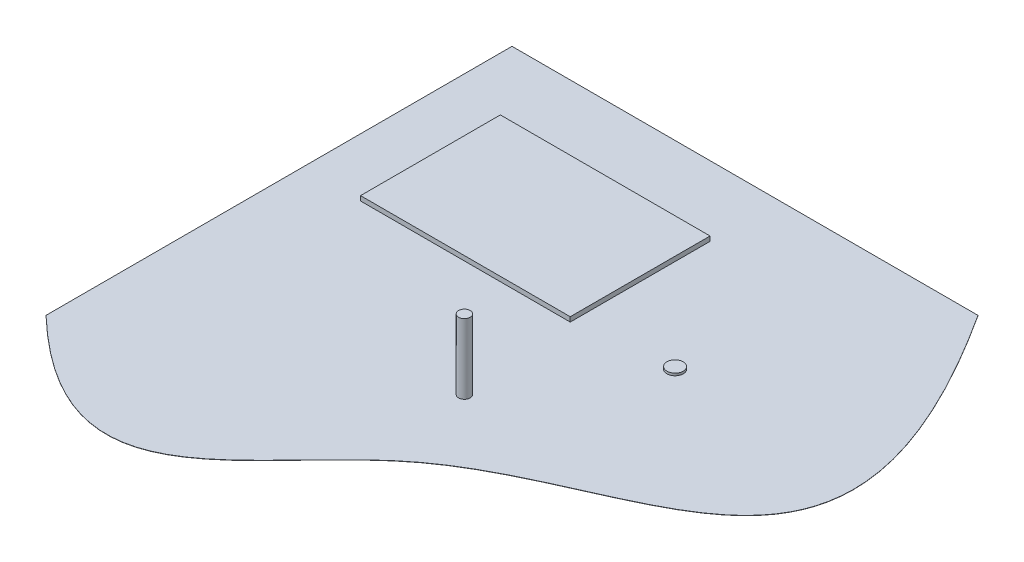
ISO-10303-21;
HEADER;
FILE_DESCRIPTION(('STEP AP214'),'2;1');
FILE_NAME('part.step','',(''),(''),'','','');
FILE_SCHEMA(('AUTOMOTIVE_DESIGN { 1 0 10303 214 1 1 1 1 }'));
ENDSEC;
DATA;
#1=APPLICATION_CONTEXT('core data for automotive mechanical design processes');
#2=APPLICATION_PROTOCOL_DEFINITION('international standard','automotive_design',2000,#1);
#3=PRODUCT_CONTEXT('',#1,'mechanical');
#4=PRODUCT('Part','Part','',(#3));
#5=PRODUCT_RELATED_PRODUCT_CATEGORY('part','',(#4));
#6=PRODUCT_DEFINITION_FORMATION('','',#4);
#7=PRODUCT_DEFINITION_CONTEXT('part definition',#1,'design');
#8=PRODUCT_DEFINITION('design','',#6,#7);
#9=PRODUCT_DEFINITION_SHAPE('','',#8);
#10=(LENGTH_UNIT() NAMED_UNIT(*) SI_UNIT(.MILLI.,.METRE.));
#11=(NAMED_UNIT(*) PLANE_ANGLE_UNIT() SI_UNIT($,.RADIAN.));
#12=(NAMED_UNIT(*) SI_UNIT($,.STERADIAN.) SOLID_ANGLE_UNIT());
#13=UNCERTAINTY_MEASURE_WITH_UNIT(LENGTH_MEASURE(1.E-05),#10,'distance_accuracy_value','');
#14=(GEOMETRIC_REPRESENTATION_CONTEXT(3) GLOBAL_UNCERTAINTY_ASSIGNED_CONTEXT((#13)) GLOBAL_UNIT_ASSIGNED_CONTEXT((#10,
#11,#12)) REPRESENTATION_CONTEXT('',''));
#15=CARTESIAN_POINT('',(0.,0.,0.));
#16=DIRECTION('',(0.,0.,1.));
#17=DIRECTION('',(1.,0.,0.));
#18=AXIS2_PLACEMENT_3D('',#15,#16,#17);
#19=CARTESIAN_POINT('',(11923.76789565,3010.,13966.178533957));
#20=DIRECTION('',(0.,-1.,0.));
#21=DIRECTION('',(0.,0.,-1.));
#22=AXIS2_PLACEMENT_3D('',#19,#20,#21);
#23=CYLINDRICAL_SURFACE('',#22,249.999999999999);
#24=CARTESIAN_POINT('',(11923.76789565,3010.,13966.178533957));
#25=DIRECTION('',(0.,1.,0.));
#26=DIRECTION('',(0.,0.,1.));
#27=AXIS2_PLACEMENT_3D('',#24,#25,#26);
#28=CIRCLE('',#27,249.999999999999);
#29=CARTESIAN_POINT('',(11923.76789565,3010.,14216.178533957));
#30=VERTEX_POINT('',#29);
#31=EDGE_CURVE('E11',#30,#30,#28,.T.);
#32=ORIENTED_EDGE('',*,*,#31,.F.);
#33=EDGE_LOOP('',(#32));
#34=FACE_BOUND('',#33,.T.);
#35=CARTESIAN_POINT('',(11923.76789565,10.,13966.178533957));
#36=DIRECTION('',(0.,1.,0.));
#37=DIRECTION('',(0.,0.,1.));
#38=AXIS2_PLACEMENT_3D('',#35,#36,#37);
#39=CIRCLE('',#38,249.999999999999);
#40=CARTESIAN_POINT('',(11923.76789565,10.,14216.178533957));
#41=VERTEX_POINT('',#40);
#42=EDGE_CURVE('E53',#41,#41,#39,.T.);
#43=ORIENTED_EDGE('',*,*,#42,.T.);
#44=EDGE_LOOP('',(#43));
#45=FACE_BOUND('',#44,.T.);
#46=ADVANCED_FACE('F50',(#34,#45),#23,.T.);
#47=CARTESIAN_POINT('',(11923.76789565,3010.,13966.178533957));
#48=DIRECTION('',(0.,1.,0.));
#49=DIRECTION('',(0.,0.,1.));
#50=AXIS2_PLACEMENT_3D('',#47,#48,#49);
#51=PLANE('',#50);
#52=ORIENTED_EDGE('',*,*,#31,.T.);
#53=EDGE_LOOP('',(#52));
#54=FACE_BOUND('',#53,.T.);
#55=ADVANCED_FACE('F65',(#54),#51,.T.);
#56=CARTESIAN_POINT('',(11923.76789565,10.,13966.178533957));
#57=DIRECTION('',(0.,1.,0.));
#58=DIRECTION('',(0.,0.,1.));
#59=AXIS2_PLACEMENT_3D('',#56,#57,#58);
#60=PLANE('',#59);
#61=ORIENTED_EDGE('',*,*,#42,.F.);
#62=EDGE_LOOP('',(#61));
#63=FACE_BOUND('',#62,.T.);
#64=ADVANCED_FACE('F63',(#63),#60,.F.);
#65=CLOSED_SHELL('',(#46,#55,#64));
#66=MANIFOLD_SOLID_BREP('B2',#65);
#67=CARTESIAN_POINT('',(15500.,110.,8500.));
#68=DIRECTION('',(0.,-1.,0.));
#69=DIRECTION('',(0.,0.,-1.));
#70=AXIS2_PLACEMENT_3D('',#67,#68,#69);
#71=CYLINDRICAL_SURFACE('',#70,349.999999999999);
#72=CARTESIAN_POINT('',(15500.,110.,8500.));
#73=DIRECTION('',(0.,1.,0.));
#74=DIRECTION('',(0.,0.,1.));
#75=AXIS2_PLACEMENT_3D('',#72,#73,#74);
#76=CIRCLE('',#75,349.999999999999);
#77=CARTESIAN_POINT('',(15500.,110.,8850.));
#78=VERTEX_POINT('',#77);
#79=EDGE_CURVE('E49',#78,#78,#76,.T.);
#80=ORIENTED_EDGE('',*,*,#79,.F.);
#81=EDGE_LOOP('',(#80));
#82=FACE_BOUND('',#81,.T.);
#83=CARTESIAN_POINT('',(15500.,10.,8500.));
#84=DIRECTION('',(0.,1.,0.));
#85=DIRECTION('',(0.,0.,1.));
#86=AXIS2_PLACEMENT_3D('',#83,#84,#85);
#87=CIRCLE('',#86,349.999999999999);
#88=CARTESIAN_POINT('',(15500.,10.,8850.));
#89=VERTEX_POINT('',#88);
#90=EDGE_CURVE('E103',#89,#89,#87,.T.);
#91=ORIENTED_EDGE('',*,*,#90,.T.);
#92=EDGE_LOOP('',(#91));
#93=FACE_BOUND('',#92,.T.);
#94=ADVANCED_FACE('F100',(#82,#93),#71,.T.);
#95=CARTESIAN_POINT('',(15500.,110.,8500.));
#96=DIRECTION('',(0.,1.,0.));
#97=DIRECTION('',(0.,0.,1.));
#98=AXIS2_PLACEMENT_3D('',#95,#96,#97);
#99=PLANE('',#98);
#100=ORIENTED_EDGE('',*,*,#79,.T.);
#101=EDGE_LOOP('',(#100));
#102=FACE_BOUND('',#101,.T.);
#103=ADVANCED_FACE('F115',(#102),#99,.T.);
#104=CARTESIAN_POINT('',(15500.,10.,8500.));
#105=DIRECTION('',(0.,1.,0.));
#106=DIRECTION('',(0.,0.,1.));
#107=AXIS2_PLACEMENT_3D('',#104,#105,#106);
#108=PLANE('',#107);
#109=ORIENTED_EDGE('',*,*,#90,.F.);
#110=EDGE_LOOP('',(#109));
#111=FACE_BOUND('',#110,.T.);
#112=ADVANCED_FACE('F113',(#111),#108,.F.);
#113=CLOSED_SHELL('',(#94,#103,#112));
#114=MANIFOLD_SOLID_BREP('B6',#113);
#115=CARTESIAN_POINT('',(16145.9158350434,10.,15862.8564409124));
#116=DIRECTION('',(0.,-1.,0.));
#117=DIRECTION('',(0.,0.,-1.));
#118=AXIS2_PLACEMENT_3D('',#115,#116,#117);
#119=PLANE('',#118);
#120=DIRECTION('',(0.,0.,1.));
#121=VECTOR('',#120,1.);
#122=CARTESIAN_POINT('',(0.,10.,0.));
#123=LINE('',#122,#121);
#124=CARTESIAN_POINT('',(0.,10.,0.));
#125=VERTEX_POINT('',#124);
#126=CARTESIAN_POINT('',(2.44929359829471E-12,10.,20000.));
#127=VERTEX_POINT('',#126);
#128=EDGE_CURVE('E230',#125,#127,#123,.T.);
#129=ORIENTED_EDGE('',*,*,#128,.T.);
#130=CARTESIAN_POINT('',(2.44929359829471E-12,10.,20000.));
#131=CARTESIAN_POINT('',(7198.35283971014,10.,26864.519570208));
#132=CARTESIAN_POINT('',(12070.5057853964,10.,12028.8189776925));
#133=CARTESIAN_POINT('',(29348.4020602398,10.,14440.6963424072));
#134=CARTESIAN_POINT('',(20000.,10.,-8.01619678548039E-13));
#135=B_SPLINE_CURVE_WITH_KNOTS('',3,(#130,#131,#132,#133,#134),.UNSPECIFIED.,.F.,.F.,(4,1,4),
(0.,0.413559719713907,1.),.UNSPECIFIED.);
#136=CARTESIAN_POINT('',(20000.,10.,0.));
#137=VERTEX_POINT('',#136);
#138=EDGE_CURVE('E233',#127,#137,#135,.T.);
#139=ORIENTED_EDGE('',*,*,#138,.T.);
#140=DIRECTION('',(-1.,0.,0.));
#141=VECTOR('',#140,1.);
#142=CARTESIAN_POINT('',(0.,10.,0.));
#143=LINE('',#142,#141);
#144=EDGE_CURVE('E239',#137,#125,#143,.T.);
#145=ORIENTED_EDGE('',*,*,#144,.T.);
#146=EDGE_LOOP('',(#129,#139,#145));
#147=FACE_BOUND('',#146,.T.);
#148=DIRECTION('',(0.,0.,1.));
#149=VECTOR('',#148,1.);
#150=CARTESIAN_POINT('',(2500.,10.,3000.));
#151=LINE('',#150,#149);
#152=CARTESIAN_POINT('',(2500.,10.,3000.));
#153=VERTEX_POINT('',#152);
#154=CARTESIAN_POINT('',(2500.,10.,9000.));
#155=VERTEX_POINT('',#154);
#156=EDGE_CURVE('E220',#153,#155,#151,.T.);
#157=ORIENTED_EDGE('',*,*,#156,.F.);
#158=DIRECTION('',(-1.,0.,0.));
#159=VECTOR('',#158,1.);
#160=CARTESIAN_POINT('',(2500.,10.,3000.));
#161=LINE('',#160,#159);
#162=CARTESIAN_POINT('',(11500.,10.,3000.));
#163=VERTEX_POINT('',#162);
#164=EDGE_CURVE('E217',#163,#153,#161,.T.);
#165=ORIENTED_EDGE('',*,*,#164,.F.);
#166=DIRECTION('',(0.,0.,-1.));
#167=VECTOR('',#166,1.);
#168=CARTESIAN_POINT('',(11500.,10.,3000.));
#169=LINE('',#168,#167);
#170=CARTESIAN_POINT('',(11500.,10.,9000.));
#171=VERTEX_POINT('',#170);
#172=EDGE_CURVE('E161',#171,#163,#169,.T.);
#173=ORIENTED_EDGE('',*,*,#172,.F.);
#174=DIRECTION('',(1.,0.,0.));
#175=VECTOR('',#174,1.);
#176=CARTESIAN_POINT('',(2500.,10.,9000.));
#177=LINE('',#176,#175);
#178=EDGE_CURVE('E156',#155,#171,#177,.T.);
#179=ORIENTED_EDGE('',*,*,#178,.F.);
#180=EDGE_LOOP('',(#157,#165,#173,#179));
#181=FACE_BOUND('',#180,.T.);
#182=ADVANCED_FACE('F141',(#147,#181),#119,.F.);
#183=CARTESIAN_POINT('',(0.,10.,0.));
#184=DIRECTION('',(1.,0.,0.));
#185=DIRECTION('',(0.,0.,-1.));
#186=AXIS2_PLACEMENT_3D('',#183,#184,#185);
#187=PLANE('',#186);
#188=DIRECTION('',(0.,0.,1.));
#189=VECTOR('',#188,1.);
#190=CARTESIAN_POINT('',(0.,0.,0.));
#191=LINE('',#190,#189);
#192=CARTESIAN_POINT('',(0.,0.,0.));
#193=VERTEX_POINT('',#192);
#194=CARTESIAN_POINT('',(2.44929359829471E-12,0.,20000.));
#195=VERTEX_POINT('',#194);
#196=EDGE_CURVE('E221',#193,#195,#191,.T.);
#197=ORIENTED_EDGE('',*,*,#196,.T.);
#198=DIRECTION('',(0.,-1.,0.));
#199=VECTOR('',#198,1.);
#200=CARTESIAN_POINT('',(2.44929359829471E-12,10.,20000.));
#201=LINE('',#200,#199);
#202=EDGE_CURVE('E98',#127,#195,#201,.T.);
#203=ORIENTED_EDGE('',*,*,#202,.F.);
#204=ORIENTED_EDGE('',*,*,#128,.F.);
#205=DIRECTION('',(0.,-1.,0.));
#206=VECTOR('',#205,1.);
#207=CARTESIAN_POINT('',(0.,10.,0.));
#208=LINE('',#207,#206);
#209=EDGE_CURVE('E331',#125,#193,#208,.T.);
#210=ORIENTED_EDGE('',*,*,#209,.T.);
#211=EDGE_LOOP('',(#197,#203,#204,#210));
#212=FACE_BOUND('',#211,.T.);
#213=ADVANCED_FACE('F143',(#212),#187,.F.);
#214=DIRECTION('',(0.,-1.,0.));
#215=VECTOR('',#214,1.);
#216=SURFACE_OF_LINEAR_EXTRUSION('',#135,#215);
#217=CARTESIAN_POINT('',(2.44929359829471E-12,0.,20000.));
#218=CARTESIAN_POINT('',(7198.35283971014,0.,26864.519570208));
#219=CARTESIAN_POINT('',(12070.5057853964,0.,12028.8189776925));
#220=CARTESIAN_POINT('',(29348.4020602398,0.,14440.6963424072));
#221=CARTESIAN_POINT('',(20000.,0.,-8.01619678548039E-13));
#222=B_SPLINE_CURVE_WITH_KNOTS('',3,(#217,#218,#219,#220,#221),.UNSPECIFIED.,.F.,.F.,(4,1,4),
(0.,0.413559719713907,1.),.UNSPECIFIED.);
#223=CARTESIAN_POINT('',(20000.,0.,0.));
#224=VERTEX_POINT('',#223);
#225=EDGE_CURVE('E224',#195,#224,#222,.T.);
#226=ORIENTED_EDGE('',*,*,#225,.T.);
#227=DIRECTION('',(0.,-1.,0.));
#228=VECTOR('',#227,1.);
#229=CARTESIAN_POINT('',(20000.,10.,0.));
#230=LINE('',#229,#228);
#231=EDGE_CURVE('E149',#137,#224,#230,.T.);
#232=ORIENTED_EDGE('',*,*,#231,.F.);
#233=ORIENTED_EDGE('',*,*,#138,.F.);
#234=ORIENTED_EDGE('',*,*,#202,.T.);
#235=EDGE_LOOP('',(#226,#232,#233,#234));
#236=FACE_BOUND('',#235,.T.);
#237=ADVANCED_FACE('F243',(#236),#216,.F.);
#238=CARTESIAN_POINT('',(0.,10.,0.));
#239=DIRECTION('',(0.,0.,1.));
#240=DIRECTION('',(1.,0.,0.));
#241=AXIS2_PLACEMENT_3D('',#238,#239,#240);
#242=PLANE('',#241);
#243=DIRECTION('',(-1.,0.,0.));
#244=VECTOR('',#243,1.);
#245=CARTESIAN_POINT('',(0.,0.,0.));
#246=LINE('',#245,#244);
#247=EDGE_CURVE('E234',#224,#193,#246,.T.);
#248=ORIENTED_EDGE('',*,*,#247,.T.);
#249=ORIENTED_EDGE('',*,*,#209,.F.);
#250=ORIENTED_EDGE('',*,*,#144,.F.);
#251=ORIENTED_EDGE('',*,*,#231,.T.);
#252=EDGE_LOOP('',(#248,#249,#250,#251));
#253=FACE_BOUND('',#252,.T.);
#254=ADVANCED_FACE('F246',(#253),#242,.F.);
#255=CARTESIAN_POINT('',(16145.9158350434,0.,15862.8564409124));
#256=DIRECTION('',(0.,-1.,0.));
#257=DIRECTION('',(0.,0.,-1.));
#258=AXIS2_PLACEMENT_3D('',#255,#256,#257);
#259=PLANE('',#258);
#260=ORIENTED_EDGE('',*,*,#196,.F.);
#261=ORIENTED_EDGE('',*,*,#247,.F.);
#262=ORIENTED_EDGE('',*,*,#225,.F.);
#263=EDGE_LOOP('',(#260,#261,#262));
#264=FACE_BOUND('',#263,.T.);
#265=ADVANCED_FACE('F250',(#264),#259,.T.);
#266=CARTESIAN_POINT('',(2500.,210.,3000.));
#267=DIRECTION('',(1.,0.,0.));
#268=DIRECTION('',(0.,0.,-1.));
#269=AXIS2_PLACEMENT_3D('',#266,#267,#268);
#270=PLANE('',#269);
#271=ORIENTED_EDGE('',*,*,#156,.T.);
#272=DIRECTION('',(0.,-1.,0.));
#273=VECTOR('',#272,1.);
#274=CARTESIAN_POINT('',(2500.,210.,9000.));
#275=LINE('',#274,#273);
#276=CARTESIAN_POINT('',(2500.,210.,9000.));
#277=VERTEX_POINT('',#276);
#278=EDGE_CURVE('E201',#277,#155,#275,.T.);
#279=ORIENTED_EDGE('',*,*,#278,.F.);
#280=DIRECTION('',(0.,0.,1.));
#281=VECTOR('',#280,1.);
#282=CARTESIAN_POINT('',(2500.,210.,3000.));
#283=LINE('',#282,#281);
#284=CARTESIAN_POINT('',(2500.,210.,3000.));
#285=VERTEX_POINT('',#284);
#286=EDGE_CURVE('E208',#285,#277,#283,.T.);
#287=ORIENTED_EDGE('',*,*,#286,.F.);
#288=DIRECTION('',(0.,-1.,0.));
#289=VECTOR('',#288,1.);
#290=CARTESIAN_POINT('',(2500.,210.,3000.));
#291=LINE('',#290,#289);
#292=EDGE_CURVE('E347',#285,#153,#291,.T.);
#293=ORIENTED_EDGE('',*,*,#292,.T.);
#294=EDGE_LOOP('',(#271,#279,#287,#293));
#295=FACE_BOUND('',#294,.T.);
#296=ADVANCED_FACE('F219',(#295),#270,.F.);
#297=CARTESIAN_POINT('',(2500.,210.,9000.));
#298=DIRECTION('',(0.,0.,-1.));
#299=DIRECTION('',(-1.,0.,0.));
#300=AXIS2_PLACEMENT_3D('',#297,#298,#299);
#301=PLANE('',#300);
#302=ORIENTED_EDGE('',*,*,#178,.T.);
#303=DIRECTION('',(0.,-1.,0.));
#304=VECTOR('',#303,1.);
#305=CARTESIAN_POINT('',(11500.,210.,9000.));
#306=LINE('',#305,#304);
#307=CARTESIAN_POINT('',(11500.,210.,9000.));
#308=VERTEX_POINT('',#307);
#309=EDGE_CURVE('E204',#308,#171,#306,.T.);
#310=ORIENTED_EDGE('',*,*,#309,.F.);
#311=DIRECTION('',(1.,0.,0.));
#312=VECTOR('',#311,1.);
#313=CARTESIAN_POINT('',(2500.,210.,9000.));
#314=LINE('',#313,#312);
#315=EDGE_CURVE('E197',#277,#308,#314,.T.);
#316=ORIENTED_EDGE('',*,*,#315,.F.);
#317=ORIENTED_EDGE('',*,*,#278,.T.);
#318=EDGE_LOOP('',(#302,#310,#316,#317));
#319=FACE_BOUND('',#318,.T.);
#320=ADVANCED_FACE('F199',(#319),#301,.F.);
#321=CARTESIAN_POINT('',(11500.,210.,3000.));
#322=DIRECTION('',(-1.,0.,0.));
#323=DIRECTION('',(0.,0.,1.));
#324=AXIS2_PLACEMENT_3D('',#321,#322,#323);
#325=PLANE('',#324);
#326=ORIENTED_EDGE('',*,*,#172,.T.);
#327=DIRECTION('',(0.,-1.,0.));
#328=VECTOR('',#327,1.);
#329=CARTESIAN_POINT('',(11500.,210.,3000.));
#330=LINE('',#329,#328);
#331=CARTESIAN_POINT('',(11500.,210.,3000.));
#332=VERTEX_POINT('',#331);
#333=EDGE_CURVE('E226',#332,#163,#330,.T.);
#334=ORIENTED_EDGE('',*,*,#333,.F.);
#335=DIRECTION('',(0.,0.,-1.));
#336=VECTOR('',#335,1.);
#337=CARTESIAN_POINT('',(11500.,210.,3000.));
#338=LINE('',#337,#336);
#339=EDGE_CURVE('E207',#308,#332,#338,.T.);
#340=ORIENTED_EDGE('',*,*,#339,.F.);
#341=ORIENTED_EDGE('',*,*,#309,.T.);
#342=EDGE_LOOP('',(#326,#334,#340,#341));
#343=FACE_BOUND('',#342,.T.);
#344=ADVANCED_FACE('F262',(#343),#325,.F.);
#345=CARTESIAN_POINT('',(2500.,210.,3000.));
#346=DIRECTION('',(0.,0.,1.));
#347=DIRECTION('',(1.,0.,0.));
#348=AXIS2_PLACEMENT_3D('',#345,#346,#347);
#349=PLANE('',#348);
#350=ORIENTED_EDGE('',*,*,#164,.T.);
#351=ORIENTED_EDGE('',*,*,#292,.F.);
#352=DIRECTION('',(-1.,0.,0.));
#353=VECTOR('',#352,1.);
#354=CARTESIAN_POINT('',(2500.,210.,3000.));
#355=LINE('',#354,#353);
#356=EDGE_CURVE('E213',#332,#285,#355,.T.);
#357=ORIENTED_EDGE('',*,*,#356,.F.);
#358=ORIENTED_EDGE('',*,*,#333,.T.);
#359=EDGE_LOOP('',(#350,#351,#357,#358));
#360=FACE_BOUND('',#359,.T.);
#361=ADVANCED_FACE('F265',(#360),#349,.F.);
#362=CARTESIAN_POINT('',(0.,210.,0.));
#363=DIRECTION('',(0.,1.,0.));
#364=DIRECTION('',(0.,0.,1.));
#365=AXIS2_PLACEMENT_3D('',#362,#363,#364);
#366=PLANE('',#365);
#367=ORIENTED_EDGE('',*,*,#286,.T.);
#368=ORIENTED_EDGE('',*,*,#315,.T.);
#369=ORIENTED_EDGE('',*,*,#339,.T.);
#370=ORIENTED_EDGE('',*,*,#356,.T.);
#371=EDGE_LOOP('',(#367,#368,#369,#370));
#372=FACE_BOUND('',#371,.T.);
#373=ADVANCED_FACE('F211',(#372),#366,.T.);
#374=CLOSED_SHELL('',(#182,#213,#237,#254,#265,#296,#320,#344,#361,#373));
#375=MANIFOLD_SOLID_BREP('B44',#374);
#376=ADVANCED_BREP_SHAPE_REPRESENTATION('',(#18,#66,#114,#375),#14);
#377=SHAPE_DEFINITION_REPRESENTATION(#9,#376);
ENDSEC;
END-ISO-10303-21;
